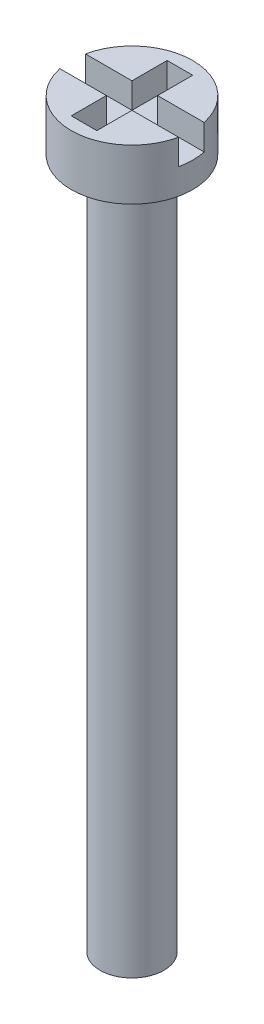
ISO-10303-21;
HEADER;
FILE_DESCRIPTION(('STEP AP214'),'2;1');
FILE_NAME('part.step','',(''),(''),'','','');
FILE_SCHEMA(('AUTOMOTIVE_DESIGN { 1 0 10303 214 1 1 1 1 }'));
ENDSEC;
DATA;
#1=APPLICATION_CONTEXT('core data for automotive mechanical design processes');
#2=APPLICATION_PROTOCOL_DEFINITION('international standard','automotive_design',2000,#1);
#3=PRODUCT_CONTEXT('',#1,'mechanical');
#4=PRODUCT('Part','Part','',(#3));
#5=PRODUCT_RELATED_PRODUCT_CATEGORY('part','',(#4));
#6=PRODUCT_DEFINITION_FORMATION('','',#4);
#7=PRODUCT_DEFINITION_CONTEXT('part definition',#1,'design');
#8=PRODUCT_DEFINITION('design','',#6,#7);
#9=PRODUCT_DEFINITION_SHAPE('','',#8);
#10=(LENGTH_UNIT() NAMED_UNIT(*) SI_UNIT(.MILLI.,.METRE.));
#11=(NAMED_UNIT(*) PLANE_ANGLE_UNIT() SI_UNIT($,.RADIAN.));
#12=(NAMED_UNIT(*) SI_UNIT($,.STERADIAN.) SOLID_ANGLE_UNIT());
#13=UNCERTAINTY_MEASURE_WITH_UNIT(LENGTH_MEASURE(1.E-05),#10,'distance_accuracy_value','');
#14=(GEOMETRIC_REPRESENTATION_CONTEXT(3) GLOBAL_UNCERTAINTY_ASSIGNED_CONTEXT((#13)) GLOBAL_UNIT_ASSIGNED_CONTEXT((#10,
#11,#12)) REPRESENTATION_CONTEXT('',''));
#15=CARTESIAN_POINT('',(0.,0.,0.));
#16=DIRECTION('',(0.,0.,1.));
#17=DIRECTION('',(1.,0.,0.));
#18=AXIS2_PLACEMENT_3D('',#15,#16,#17);
#19=CARTESIAN_POINT('',(-3.50234861591695,28.,-0.5));
#20=DIRECTION('',(0.,0.,-1.));
#21=DIRECTION('',(-1.,0.,0.));
#22=AXIS2_PLACEMENT_3D('',#19,#20,#21);
#23=PLANE('',#22);
#24=DIRECTION('',(-1.,0.,0.));
#25=VECTOR('',#24,1.);
#26=CARTESIAN_POINT('',(-3.50234861591695,28.,-0.5));
#27=LINE('',#26,#25);
#28=CARTESIAN_POINT('',(-0.5,28.,-0.5));
#29=VERTEX_POINT('',#28);
#30=CARTESIAN_POINT('',(-2.32177195262584,28.,-0.5));
#31=VERTEX_POINT('',#30);
#32=EDGE_CURVE('E174',#29,#31,#27,.T.);
#33=ORIENTED_EDGE('',*,*,#32,.F.);
#34=DIRECTION('',(0.,1.,0.));
#35=VECTOR('',#34,1.);
#36=CARTESIAN_POINT('',(-0.5,28.,-0.5));
#37=LINE('',#36,#35);
#38=CARTESIAN_POINT('',(-0.5,29.,-0.5));
#39=VERTEX_POINT('',#38);
#40=EDGE_CURVE('E169',#29,#39,#37,.T.);
#41=ORIENTED_EDGE('',*,*,#40,.T.);
#42=DIRECTION('',(-1.,0.,0.));
#43=VECTOR('',#42,1.);
#44=CARTESIAN_POINT('',(0.,29.,-0.5));
#45=LINE('',#44,#43);
#46=CARTESIAN_POINT('',(-2.32177195262584,29.,-0.5));
#47=VERTEX_POINT('',#46);
#48=EDGE_CURVE('E206',#39,#47,#45,.T.);
#49=ORIENTED_EDGE('',*,*,#48,.T.);
#50=DIRECTION('',(0.,-1.,0.));
#51=VECTOR('',#50,1.);
#52=CARTESIAN_POINT('',(-2.32177195262584,29.,-0.5));
#53=LINE('',#52,#51);
#54=EDGE_CURVE('E183',#31,#47,#53,.F.);
#55=ORIENTED_EDGE('',*,*,#54,.F.);
#56=EDGE_LOOP('',(#33,#41,#49,#55));
#57=FACE_BOUND('',#56,.T.);
#58=ADVANCED_FACE('F35',(#57),#23,.F.);
#59=CARTESIAN_POINT('',(-3.50234861591695,28.,0.5));
#60=DIRECTION('',(0.,0.,1.));
#61=DIRECTION('',(1.,0.,0.));
#62=AXIS2_PLACEMENT_3D('',#59,#60,#61);
#63=PLANE('',#62);
#64=DIRECTION('',(1.,0.,0.));
#65=VECTOR('',#64,1.);
#66=CARTESIAN_POINT('',(0.,29.,0.5));
#67=LINE('',#66,#65);
#68=CARTESIAN_POINT('',(-2.32177195262584,29.,0.5));
#69=VERTEX_POINT('',#68);
#70=CARTESIAN_POINT('',(-0.499999999999999,29.,0.5));
#71=VERTEX_POINT('',#70);
#72=EDGE_CURVE('E203',#69,#71,#67,.T.);
#73=ORIENTED_EDGE('',*,*,#72,.T.);
#74=DIRECTION('',(0.,-1.,0.));
#75=VECTOR('',#74,1.);
#76=CARTESIAN_POINT('',(-0.5,28.,0.5));
#77=LINE('',#76,#75);
#78=CARTESIAN_POINT('',(-0.499999999999999,28.,0.5));
#79=VERTEX_POINT('',#78);
#80=EDGE_CURVE('E11',#71,#79,#77,.T.);
#81=ORIENTED_EDGE('',*,*,#80,.T.);
#82=DIRECTION('',(1.,0.,0.));
#83=VECTOR('',#82,1.);
#84=CARTESIAN_POINT('',(-3.50234861591695,28.,0.5));
#85=LINE('',#84,#83);
#86=CARTESIAN_POINT('',(-2.32177195262584,28.,0.5));
#87=VERTEX_POINT('',#86);
#88=EDGE_CURVE('E130',#87,#79,#85,.T.);
#89=ORIENTED_EDGE('',*,*,#88,.F.);
#90=DIRECTION('',(0.,-1.,0.));
#91=VECTOR('',#90,1.);
#92=CARTESIAN_POINT('',(-2.32177195262584,29.,0.5));
#93=LINE('',#92,#91);
#94=EDGE_CURVE('E180',#69,#87,#93,.T.);
#95=ORIENTED_EDGE('',*,*,#94,.F.);
#96=EDGE_LOOP('',(#73,#81,#89,#95));
#97=FACE_BOUND('',#96,.T.);
#98=ADVANCED_FACE('F246',(#97),#63,.F.);
#99=CARTESIAN_POINT('',(0.,29.,0.));
#100=DIRECTION('',(0.,1.,0.));
#101=DIRECTION('',(0.,0.,1.));
#102=AXIS2_PLACEMENT_3D('',#99,#100,#101);
#103=PLANE('',#102);
#104=DIRECTION('',(0.,0.,1.));
#105=VECTOR('',#104,1.);
#106=CARTESIAN_POINT('',(-0.5,29.,-1.875));
#107=LINE('',#106,#105);
#108=CARTESIAN_POINT('',(-0.5,29.,-1.875));
#109=VERTEX_POINT('',#108);
#110=EDGE_CURVE('E151',#109,#39,#107,.T.);
#111=ORIENTED_EDGE('',*,*,#110,.F.);
#112=DIRECTION('',(-1.,0.,0.));
#113=VECTOR('',#112,1.);
#114=CARTESIAN_POINT('',(-0.5,29.,-1.875));
#115=LINE('',#114,#113);
#116=CARTESIAN_POINT('',(0.5,29.,-1.875));
#117=VERTEX_POINT('',#116);
#118=EDGE_CURVE('E132',#117,#109,#115,.T.);
#119=ORIENTED_EDGE('',*,*,#118,.F.);
#120=DIRECTION('',(0.,0.,-1.));
#121=VECTOR('',#120,1.);
#122=CARTESIAN_POINT('',(0.5,29.,-1.875));
#123=LINE('',#122,#121);
#124=CARTESIAN_POINT('',(0.5,29.,-0.5));
#125=VERTEX_POINT('',#124);
#126=EDGE_CURVE('E155',#125,#117,#123,.T.);
#127=ORIENTED_EDGE('',*,*,#126,.F.);
#128=CARTESIAN_POINT('',(2.32177195262584,29.,-0.5));
#129=VERTEX_POINT('',#128);
#130=EDGE_CURVE('E207',#129,#125,#45,.T.);
#131=ORIENTED_EDGE('',*,*,#130,.F.);
#132=CARTESIAN_POINT('',(0.,29.,0.));
#133=DIRECTION('',(0.,1.,0.));
#134=DIRECTION('',(0.,0.,1.));
#135=AXIS2_PLACEMENT_3D('',#132,#133,#134);
#136=CIRCLE('',#135,2.375);
#137=EDGE_CURVE('E193',#129,#47,#136,.T.);
#138=ORIENTED_EDGE('',*,*,#137,.T.);
#139=ORIENTED_EDGE('',*,*,#48,.F.);
#140=EDGE_LOOP('',(#111,#119,#127,#131,#138,#139));
#141=FACE_BOUND('',#140,.T.);
#142=ADVANCED_FACE('F232',(#141),#103,.T.);
#143=CARTESIAN_POINT('',(0.,27.,0.));
#144=DIRECTION('',(0.,-1.,0.));
#145=DIRECTION('',(0.,0.,-1.));
#146=AXIS2_PLACEMENT_3D('',#143,#144,#145);
#147=CYLINDRICAL_SURFACE('',#146,1.25);
#148=CARTESIAN_POINT('',(0.,27.,0.));
#149=DIRECTION('',(0.,1.,0.));
#150=DIRECTION('',(0.,0.,1.));
#151=AXIS2_PLACEMENT_3D('',#148,#149,#150);
#152=CIRCLE('',#151,1.25);
#153=CARTESIAN_POINT('',(0.,27.,1.25));
#154=VERTEX_POINT('',#153);
#155=EDGE_CURVE('E196',#154,#154,#152,.T.);
#156=ORIENTED_EDGE('',*,*,#155,.F.);
#157=EDGE_LOOP('',(#156));
#158=FACE_BOUND('',#157,.T.);
#159=CARTESIAN_POINT('',(0.,0.,0.));
#160=DIRECTION('',(0.,1.,0.));
#161=DIRECTION('',(0.,0.,1.));
#162=AXIS2_PLACEMENT_3D('',#159,#160,#161);
#163=CIRCLE('',#162,1.25);
#164=CARTESIAN_POINT('',(0.,0.,1.25));
#165=VERTEX_POINT('',#164);
#166=EDGE_CURVE('E200',#165,#165,#163,.T.);
#167=ORIENTED_EDGE('',*,*,#166,.T.);
#168=EDGE_LOOP('',(#167));
#169=FACE_BOUND('',#168,.T.);
#170=ADVANCED_FACE('F37',(#158,#169),#147,.T.);
#171=CARTESIAN_POINT('',(0.,0.,0.));
#172=DIRECTION('',(0.,1.,0.));
#173=DIRECTION('',(0.,0.,1.));
#174=AXIS2_PLACEMENT_3D('',#171,#172,#173);
#175=PLANE('',#174);
#176=ORIENTED_EDGE('',*,*,#166,.F.);
#177=EDGE_LOOP('',(#176));
#178=FACE_BOUND('',#177,.T.);
#179=ADVANCED_FACE('F360',(#178),#175,.F.);
#180=CARTESIAN_POINT('',(0.,27.,0.));
#181=DIRECTION('',(0.,1.,0.));
#182=DIRECTION('',(0.,0.,1.));
#183=AXIS2_PLACEMENT_3D('',#180,#181,#182);
#184=PLANE('',#183);
#185=CARTESIAN_POINT('',(0.,27.,0.));
#186=DIRECTION('',(0.,1.,0.));
#187=DIRECTION('',(0.,0.,1.));
#188=AXIS2_PLACEMENT_3D('',#185,#186,#187);
#189=CIRCLE('',#188,2.375);
#190=CARTESIAN_POINT('',(0.,27.,2.375));
#191=VERTEX_POINT('',#190);
#192=EDGE_CURVE('E189',#191,#191,#189,.T.);
#193=ORIENTED_EDGE('',*,*,#192,.F.);
#194=EDGE_LOOP('',(#193));
#195=FACE_BOUND('',#194,.T.);
#196=ORIENTED_EDGE('',*,*,#155,.T.);
#197=EDGE_LOOP('',(#196));
#198=FACE_BOUND('',#197,.T.);
#199=ADVANCED_FACE('F351',(#195,#198),#184,.F.);
#200=CARTESIAN_POINT('',(0.,29.,0.));
#201=DIRECTION('',(0.,-1.,0.));
#202=DIRECTION('',(0.,0.,-1.));
#203=AXIS2_PLACEMENT_3D('',#200,#201,#202);
#204=CYLINDRICAL_SURFACE('',#203,2.375);
#205=ORIENTED_EDGE('',*,*,#137,.F.);
#206=DIRECTION('',(0.,-1.,0.));
#207=VECTOR('',#206,1.);
#208=CARTESIAN_POINT('',(2.32177195262584,29.,-0.5));
#209=LINE('',#208,#207);
#210=CARTESIAN_POINT('',(2.32177195262584,28.,-0.5));
#211=VERTEX_POINT('',#210);
#212=EDGE_CURVE('E186',#129,#211,#209,.T.);
#213=ORIENTED_EDGE('',*,*,#212,.T.);
#214=CARTESIAN_POINT('',(0.,28.,0.));
#215=DIRECTION('',(0.,1.,0.));
#216=DIRECTION('',(0.,0.,1.));
#217=AXIS2_PLACEMENT_3D('',#214,#215,#216);
#218=CIRCLE('',#217,2.375);
#219=CARTESIAN_POINT('',(2.32177195262584,28.,0.5));
#220=VERTEX_POINT('',#219);
#221=EDGE_CURVE('E211',#220,#211,#218,.T.);
#222=ORIENTED_EDGE('',*,*,#221,.F.);
#223=DIRECTION('',(0.,-1.,0.));
#224=VECTOR('',#223,1.);
#225=CARTESIAN_POINT('',(2.32177195262584,29.,0.5));
#226=LINE('',#225,#224);
#227=CARTESIAN_POINT('',(2.32177195262584,29.,0.5));
#228=VERTEX_POINT('',#227);
#229=EDGE_CURVE('E177',#220,#228,#226,.F.);
#230=ORIENTED_EDGE('',*,*,#229,.T.);
#231=EDGE_CURVE('E190',#69,#228,#136,.T.);
#232=ORIENTED_EDGE('',*,*,#231,.F.);
#233=ORIENTED_EDGE('',*,*,#94,.T.);
#234=EDGE_CURVE('E210',#31,#87,#218,.T.);
#235=ORIENTED_EDGE('',*,*,#234,.F.);
#236=ORIENTED_EDGE('',*,*,#54,.T.);
#237=EDGE_LOOP('',(#205,#213,#222,#230,#232,#233,#235,#236));
#238=FACE_BOUND('',#237,.T.);
#239=ORIENTED_EDGE('',*,*,#192,.T.);
#240=EDGE_LOOP('',(#239));
#241=FACE_BOUND('',#240,.T.);
#242=ADVANCED_FACE('F224',(#238,#241),#204,.T.);
#243=CARTESIAN_POINT('',(-0.499999999999999,29.,1.875));
#244=VERTEX_POINT('',#243);
#245=EDGE_CURVE('E138',#71,#244,#107,.T.);
#246=ORIENTED_EDGE('',*,*,#245,.F.);
#247=ORIENTED_EDGE('',*,*,#72,.F.);
#248=ORIENTED_EDGE('',*,*,#231,.T.);
#249=CARTESIAN_POINT('',(0.5,29.,0.5));
#250=VERTEX_POINT('',#249);
#251=EDGE_CURVE('E199',#250,#228,#67,.T.);
#252=ORIENTED_EDGE('',*,*,#251,.F.);
#253=CARTESIAN_POINT('',(0.499999999999999,29.,1.875));
#254=VERTEX_POINT('',#253);
#255=EDGE_CURVE('E156',#254,#250,#123,.T.);
#256=ORIENTED_EDGE('',*,*,#255,.F.);
#257=DIRECTION('',(1.,0.,0.));
#258=VECTOR('',#257,1.);
#259=CARTESIAN_POINT('',(-0.499999999999999,29.,1.875));
#260=LINE('',#259,#258);
#261=EDGE_CURVE('E153',#244,#254,#260,.T.);
#262=ORIENTED_EDGE('',*,*,#261,.F.);
#263=EDGE_LOOP('',(#246,#247,#248,#252,#256,#262));
#264=FACE_BOUND('',#263,.T.);
#265=ADVANCED_FACE('F250',(#264),#103,.T.);
#266=CARTESIAN_POINT('',(-3.50234861591695,28.,0.5));
#267=DIRECTION('',(0.,1.,0.));
#268=DIRECTION('',(0.,0.,1.));
#269=AXIS2_PLACEMENT_3D('',#266,#267,#268);
#270=PLANE('',#269);
#271=CARTESIAN_POINT('',(0.5,28.,-0.5));
#272=VERTEX_POINT('',#271);
#273=EDGE_CURVE('E175',#211,#272,#27,.T.);
#274=ORIENTED_EDGE('',*,*,#273,.T.);
#275=DIRECTION('',(0.,0.,-1.));
#276=VECTOR('',#275,1.);
#277=CARTESIAN_POINT('',(0.5,28.,-1.875));
#278=LINE('',#277,#276);
#279=CARTESIAN_POINT('',(0.5,28.,-1.875));
#280=VERTEX_POINT('',#279);
#281=EDGE_CURVE('E146',#272,#280,#278,.T.);
#282=ORIENTED_EDGE('',*,*,#281,.T.);
#283=DIRECTION('',(-1.,0.,0.));
#284=VECTOR('',#283,1.);
#285=CARTESIAN_POINT('',(-0.5,28.,-1.875));
#286=LINE('',#285,#284);
#287=CARTESIAN_POINT('',(-0.5,28.,-1.875));
#288=VERTEX_POINT('',#287);
#289=EDGE_CURVE('E143',#280,#288,#286,.T.);
#290=ORIENTED_EDGE('',*,*,#289,.T.);
#291=DIRECTION('',(0.,0.,1.));
#292=VECTOR('',#291,1.);
#293=CARTESIAN_POINT('',(-0.5,28.,-1.875));
#294=LINE('',#293,#292);
#295=EDGE_CURVE('E50',#288,#29,#294,.T.);
#296=ORIENTED_EDGE('',*,*,#295,.T.);
#297=ORIENTED_EDGE('',*,*,#32,.T.);
#298=ORIENTED_EDGE('',*,*,#234,.T.);
#299=ORIENTED_EDGE('',*,*,#88,.T.);
#300=CARTESIAN_POINT('',(-0.499999999999999,28.,1.875));
#301=VERTEX_POINT('',#300);
#302=EDGE_CURVE('E123',#79,#301,#294,.T.);
#303=ORIENTED_EDGE('',*,*,#302,.T.);
#304=DIRECTION('',(1.,0.,0.));
#305=VECTOR('',#304,1.);
#306=CARTESIAN_POINT('',(-0.499999999999999,28.,1.875));
#307=LINE('',#306,#305);
#308=CARTESIAN_POINT('',(0.499999999999999,28.,1.875));
#309=VERTEX_POINT('',#308);
#310=EDGE_CURVE('E128',#301,#309,#307,.T.);
#311=ORIENTED_EDGE('',*,*,#310,.T.);
#312=CARTESIAN_POINT('',(0.5,28.,0.5));
#313=VERTEX_POINT('',#312);
#314=EDGE_CURVE('E57',#309,#313,#278,.T.);
#315=ORIENTED_EDGE('',*,*,#314,.T.);
#316=EDGE_CURVE('E172',#313,#220,#85,.T.);
#317=ORIENTED_EDGE('',*,*,#316,.T.);
#318=ORIENTED_EDGE('',*,*,#221,.T.);
#319=EDGE_LOOP('',(#274,#282,#290,#296,#297,#298,#299,#303,#311,#315,#317,#318));
#320=FACE_BOUND('',#319,.T.);
#321=ADVANCED_FACE('F126',(#320),#270,.T.);
#322=ORIENTED_EDGE('',*,*,#130,.T.);
#323=DIRECTION('',(0.,-1.,0.));
#324=VECTOR('',#323,1.);
#325=CARTESIAN_POINT('',(0.5,28.,-0.5));
#326=LINE('',#325,#324);
#327=EDGE_CURVE('E162',#125,#272,#326,.T.);
#328=ORIENTED_EDGE('',*,*,#327,.T.);
#329=ORIENTED_EDGE('',*,*,#273,.F.);
#330=ORIENTED_EDGE('',*,*,#212,.F.);
#331=EDGE_LOOP('',(#322,#328,#329,#330));
#332=FACE_BOUND('',#331,.T.);
#333=ADVANCED_FACE('F221',(#332),#23,.F.);
#334=ORIENTED_EDGE('',*,*,#316,.F.);
#335=DIRECTION('',(0.,1.,0.));
#336=VECTOR('',#335,1.);
#337=CARTESIAN_POINT('',(0.5,28.,0.5));
#338=LINE('',#337,#336);
#339=EDGE_CURVE('E43',#313,#250,#338,.T.);
#340=ORIENTED_EDGE('',*,*,#339,.T.);
#341=ORIENTED_EDGE('',*,*,#251,.T.);
#342=ORIENTED_EDGE('',*,*,#229,.F.);
#343=EDGE_LOOP('',(#334,#340,#341,#342));
#344=FACE_BOUND('',#343,.T.);
#345=ADVANCED_FACE('F254',(#344),#63,.F.);
#346=CARTESIAN_POINT('',(0.5,28.,-1.875));
#347=DIRECTION('',(1.,0.,0.));
#348=DIRECTION('',(0.,0.,-1.));
#349=AXIS2_PLACEMENT_3D('',#346,#347,#348);
#350=PLANE('',#349);
#351=ORIENTED_EDGE('',*,*,#314,.F.);
#352=DIRECTION('',(0.,1.,0.));
#353=VECTOR('',#352,1.);
#354=CARTESIAN_POINT('',(0.499999999999999,28.,1.875));
#355=LINE('',#354,#353);
#356=EDGE_CURVE('E142',#309,#254,#355,.T.);
#357=ORIENTED_EDGE('',*,*,#356,.T.);
#358=ORIENTED_EDGE('',*,*,#255,.T.);
#359=ORIENTED_EDGE('',*,*,#339,.F.);
#360=EDGE_LOOP('',(#351,#357,#358,#359));
#361=FACE_BOUND('',#360,.T.);
#362=ADVANCED_FACE('F253',(#361),#350,.F.);
#363=CARTESIAN_POINT('',(-0.5,28.,-1.875));
#364=DIRECTION('',(-1.,0.,0.));
#365=DIRECTION('',(0.,0.,1.));
#366=AXIS2_PLACEMENT_3D('',#363,#364,#365);
#367=PLANE('',#366);
#368=ORIENTED_EDGE('',*,*,#245,.T.);
#369=DIRECTION('',(0.,1.,0.));
#370=VECTOR('',#369,1.);
#371=CARTESIAN_POINT('',(-0.499999999999999,28.,1.875));
#372=LINE('',#371,#370);
#373=EDGE_CURVE('E135',#301,#244,#372,.T.);
#374=ORIENTED_EDGE('',*,*,#373,.F.);
#375=ORIENTED_EDGE('',*,*,#302,.F.);
#376=ORIENTED_EDGE('',*,*,#80,.F.);
#377=EDGE_LOOP('',(#368,#374,#375,#376));
#378=FACE_BOUND('',#377,.T.);
#379=ADVANCED_FACE('F136',(#378),#367,.F.);
#380=CARTESIAN_POINT('',(-0.499999999999999,28.,1.875));
#381=DIRECTION('',(0.,0.,1.));
#382=DIRECTION('',(1.,0.,0.));
#383=AXIS2_PLACEMENT_3D('',#380,#381,#382);
#384=PLANE('',#383);
#385=ORIENTED_EDGE('',*,*,#261,.T.);
#386=ORIENTED_EDGE('',*,*,#356,.F.);
#387=ORIENTED_EDGE('',*,*,#310,.F.);
#388=ORIENTED_EDGE('',*,*,#373,.T.);
#389=EDGE_LOOP('',(#385,#386,#387,#388));
#390=FACE_BOUND('',#389,.T.);
#391=ADVANCED_FACE('F145',(#390),#384,.F.);
#392=ORIENTED_EDGE('',*,*,#295,.F.);
#393=DIRECTION('',(0.,1.,0.));
#394=VECTOR('',#393,1.);
#395=CARTESIAN_POINT('',(-0.5,28.,-1.875));
#396=LINE('',#395,#394);
#397=EDGE_CURVE('E160',#288,#109,#396,.T.);
#398=ORIENTED_EDGE('',*,*,#397,.T.);
#399=ORIENTED_EDGE('',*,*,#110,.T.);
#400=ORIENTED_EDGE('',*,*,#40,.F.);
#401=EDGE_LOOP('',(#392,#398,#399,#400));
#402=FACE_BOUND('',#401,.T.);
#403=ADVANCED_FACE('F242',(#402),#367,.F.);
#404=ORIENTED_EDGE('',*,*,#126,.T.);
#405=DIRECTION('',(0.,1.,0.));
#406=VECTOR('',#405,1.);
#407=CARTESIAN_POINT('',(0.5,28.,-1.875));
#408=LINE('',#407,#406);
#409=EDGE_CURVE('E163',#280,#117,#408,.T.);
#410=ORIENTED_EDGE('',*,*,#409,.F.);
#411=ORIENTED_EDGE('',*,*,#281,.F.);
#412=ORIENTED_EDGE('',*,*,#327,.F.);
#413=EDGE_LOOP('',(#404,#410,#411,#412));
#414=FACE_BOUND('',#413,.T.);
#415=ADVANCED_FACE('F237',(#414),#350,.F.);
#416=CARTESIAN_POINT('',(-0.5,28.,-1.875));
#417=DIRECTION('',(0.,0.,-1.));
#418=DIRECTION('',(-1.,0.,0.));
#419=AXIS2_PLACEMENT_3D('',#416,#417,#418);
#420=PLANE('',#419);
#421=ORIENTED_EDGE('',*,*,#118,.T.);
#422=ORIENTED_EDGE('',*,*,#397,.F.);
#423=ORIENTED_EDGE('',*,*,#289,.F.);
#424=ORIENTED_EDGE('',*,*,#409,.T.);
#425=EDGE_LOOP('',(#421,#422,#423,#424));
#426=FACE_BOUND('',#425,.T.);
#427=ADVANCED_FACE('F240',(#426),#420,.F.);
#428=CLOSED_SHELL('',(#58,#98,#142,#170,#179,#199,#242,#265,#321,#333,#345,#362,#379,#391,#403,
#415,#427));
#429=MANIFOLD_SOLID_BREP('B2',#428);
#430=ADVANCED_BREP_SHAPE_REPRESENTATION('',(#18,#429),#14);
#431=SHAPE_DEFINITION_REPRESENTATION(#9,#430);
ENDSEC;
END-ISO-10303-21;
